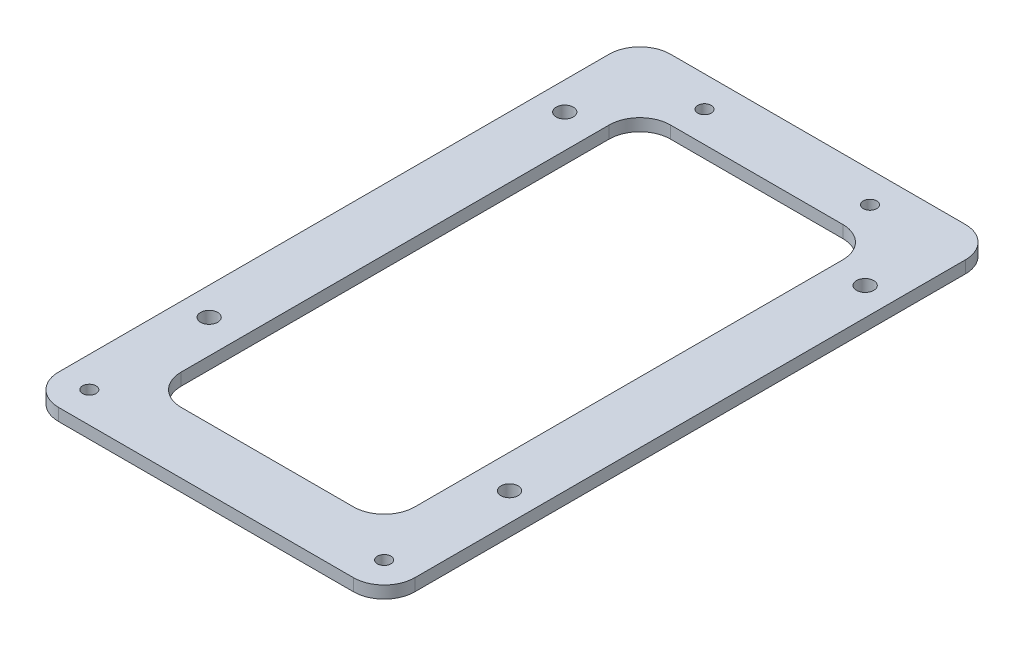
ISO-10303-21;
HEADER;
FILE_DESCRIPTION(('STEP AP214'),'2;1');
FILE_NAME('part.step','',(''),(''),'','','');
FILE_SCHEMA(('AUTOMOTIVE_DESIGN { 1 0 10303 214 1 1 1 1 }'));
ENDSEC;
DATA;
#1=APPLICATION_CONTEXT('core data for automotive mechanical design processes');
#2=APPLICATION_PROTOCOL_DEFINITION('international standard','automotive_design',2000,#1);
#3=PRODUCT_CONTEXT('',#1,'mechanical');
#4=PRODUCT('Part','Part','',(#3));
#5=PRODUCT_RELATED_PRODUCT_CATEGORY('part','',(#4));
#6=PRODUCT_DEFINITION_FORMATION('','',#4);
#7=PRODUCT_DEFINITION_CONTEXT('part definition',#1,'design');
#8=PRODUCT_DEFINITION('design','',#6,#7);
#9=PRODUCT_DEFINITION_SHAPE('','',#8);
#10=(LENGTH_UNIT() NAMED_UNIT(*) SI_UNIT(.MILLI.,.METRE.));
#11=(NAMED_UNIT(*) PLANE_ANGLE_UNIT() SI_UNIT($,.RADIAN.));
#12=(NAMED_UNIT(*) SI_UNIT($,.STERADIAN.) SOLID_ANGLE_UNIT());
#13=UNCERTAINTY_MEASURE_WITH_UNIT(LENGTH_MEASURE(1.E-05),#10,'distance_accuracy_value','');
#14=(GEOMETRIC_REPRESENTATION_CONTEXT(3) GLOBAL_UNCERTAINTY_ASSIGNED_CONTEXT((#13)) GLOBAL_UNIT_ASSIGNED_CONTEXT((#10,
#11,#12)) REPRESENTATION_CONTEXT('',''));
#15=CARTESIAN_POINT('',(0.,0.,0.));
#16=DIRECTION('',(0.,0.,1.));
#17=DIRECTION('',(1.,0.,0.));
#18=AXIS2_PLACEMENT_3D('',#15,#16,#17);
#19=CARTESIAN_POINT('',(0.,0.,0.));
#20=DIRECTION('',(0.,1.,0.));
#21=DIRECTION('',(0.,0.,1.));
#22=AXIS2_PLACEMENT_3D('',#19,#20,#21);
#23=PLANE('',#22);
#24=CARTESIAN_POINT('',(24.05,0.,50.1));
#25=DIRECTION('',(0.,1.,0.));
#26=DIRECTION('',(0.,0.,1.));
#27=AXIS2_PLACEMENT_3D('',#24,#25,#26);
#28=CIRCLE('',#27,1.09999999999999);
#29=CARTESIAN_POINT('',(24.05,0.,51.2));
#30=VERTEX_POINT('',#29);
#31=EDGE_CURVE('E319',#30,#30,#28,.T.);
#32=ORIENTED_EDGE('',*,*,#31,.T.);
#33=EDGE_LOOP('',(#32));
#34=FACE_BOUND('',#33,.T.);
#35=DIRECTION('',(0.,0.,1.));
#36=VECTOR('',#35,1.);
#37=CARTESIAN_POINT('',(-29.05,0.,-44.7));
#38=LINE('',#37,#36);
#39=CARTESIAN_POINT('',(-29.05,0.,-39.7));
#40=VERTEX_POINT('',#39);
#41=CARTESIAN_POINT('',(-29.05,0.,50.1));
#42=VERTEX_POINT('',#41);
#43=EDGE_CURVE('E344',#40,#42,#38,.T.);
#44=ORIENTED_EDGE('',*,*,#43,.F.);
#45=CARTESIAN_POINT('',(-24.05,0.,-39.7));
#46=DIRECTION('',(0.,1.,0.));
#47=DIRECTION('',(0.,0.,1.));
#48=AXIS2_PLACEMENT_3D('',#45,#46,#47);
#49=CIRCLE('',#48,5.);
#50=CARTESIAN_POINT('',(-24.05,0.,-44.7));
#51=VERTEX_POINT('',#50);
#52=EDGE_CURVE('E228',#40,#51,#49,.F.);
#53=ORIENTED_EDGE('',*,*,#52,.T.);
#54=DIRECTION('',(-1.,0.,0.));
#55=VECTOR('',#54,1.);
#56=CARTESIAN_POINT('',(29.05,0.,-44.7));
#57=LINE('',#56,#55);
#58=CARTESIAN_POINT('',(24.05,0.,-44.7));
#59=VERTEX_POINT('',#58);
#60=EDGE_CURVE('E327',#59,#51,#57,.T.);
#61=ORIENTED_EDGE('',*,*,#60,.F.);
#62=CARTESIAN_POINT('',(24.05,0.,-39.7));
#63=DIRECTION('',(0.,1.,0.));
#64=DIRECTION('',(0.,0.,1.));
#65=AXIS2_PLACEMENT_3D('',#62,#63,#64);
#66=CIRCLE('',#65,5.);
#67=CARTESIAN_POINT('',(29.05,0.,-39.7));
#68=VERTEX_POINT('',#67);
#69=EDGE_CURVE('E225',#59,#68,#66,.F.);
#70=ORIENTED_EDGE('',*,*,#69,.T.);
#71=DIRECTION('',(0.,0.,-1.));
#72=VECTOR('',#71,1.);
#73=CARTESIAN_POINT('',(29.05,0.,55.1));
#74=LINE('',#73,#72);
#75=CARTESIAN_POINT('',(29.05,0.,50.1));
#76=VERTEX_POINT('',#75);
#77=EDGE_CURVE('E193',#76,#68,#74,.T.);
#78=ORIENTED_EDGE('',*,*,#77,.F.);
#79=CARTESIAN_POINT('',(24.05,0.,50.1));
#80=DIRECTION('',(0.,1.,0.));
#81=DIRECTION('',(0.,0.,1.));
#82=AXIS2_PLACEMENT_3D('',#79,#80,#81);
#83=CIRCLE('',#82,5.);
#84=CARTESIAN_POINT('',(24.05,0.,55.1));
#85=VERTEX_POINT('',#84);
#86=EDGE_CURVE('E222',#76,#85,#83,.F.);
#87=ORIENTED_EDGE('',*,*,#86,.T.);
#88=DIRECTION('',(1.,0.,0.));
#89=VECTOR('',#88,1.);
#90=CARTESIAN_POINT('',(-29.05,0.,55.1));
#91=LINE('',#90,#89);
#92=CARTESIAN_POINT('',(-24.05,0.,55.1));
#93=VERTEX_POINT('',#92);
#94=EDGE_CURVE('E347',#93,#85,#91,.T.);
#95=ORIENTED_EDGE('',*,*,#94,.F.);
#96=CARTESIAN_POINT('',(-24.05,0.,50.1));
#97=DIRECTION('',(0.,1.,0.));
#98=DIRECTION('',(0.,0.,1.));
#99=AXIS2_PLACEMENT_3D('',#96,#97,#98);
#100=CIRCLE('',#99,5.);
#101=EDGE_CURVE('E219',#93,#42,#100,.F.);
#102=ORIENTED_EDGE('',*,*,#101,.T.);
#103=EDGE_LOOP('',(#44,#53,#61,#70,#78,#87,#95,#102));
#104=FACE_BOUND('',#103,.T.);
#105=DIRECTION('',(0.,0.,1.));
#106=VECTOR('',#105,1.);
#107=CARTESIAN_POINT('',(-19.05,0.,-34.7));
#108=LINE('',#107,#106);
#109=CARTESIAN_POINT('',(-19.05,0.,-29.7));
#110=VERTEX_POINT('',#109);
#111=CARTESIAN_POINT('',(-19.05,0.,40.1));
#112=VERTEX_POINT('',#111);
#113=EDGE_CURVE('E160',#110,#112,#108,.T.);
#114=ORIENTED_EDGE('',*,*,#113,.T.);
#115=CARTESIAN_POINT('',(-14.05,0.,40.1));
#116=DIRECTION('',(0.,1.,0.));
#117=DIRECTION('',(0.,0.,1.));
#118=AXIS2_PLACEMENT_3D('',#115,#116,#117);
#119=CIRCLE('',#118,5.);
#120=CARTESIAN_POINT('',(-14.05,0.,45.1));
#121=VERTEX_POINT('',#120);
#122=EDGE_CURVE('E155',#112,#121,#119,.T.);
#123=ORIENTED_EDGE('',*,*,#122,.T.);
#124=DIRECTION('',(1.,0.,0.));
#125=VECTOR('',#124,1.);
#126=CARTESIAN_POINT('',(-19.05,0.,45.1));
#127=LINE('',#126,#125);
#128=CARTESIAN_POINT('',(14.05,0.,45.1));
#129=VERTEX_POINT('',#128);
#130=EDGE_CURVE('E158',#121,#129,#127,.T.);
#131=ORIENTED_EDGE('',*,*,#130,.T.);
#132=CARTESIAN_POINT('',(14.05,0.,40.1));
#133=DIRECTION('',(0.,1.,0.));
#134=DIRECTION('',(0.,0.,1.));
#135=AXIS2_PLACEMENT_3D('',#132,#133,#134);
#136=CIRCLE('',#135,5.);
#137=CARTESIAN_POINT('',(19.05,0.,40.1));
#138=VERTEX_POINT('',#137);
#139=EDGE_CURVE('E265',#129,#138,#136,.T.);
#140=ORIENTED_EDGE('',*,*,#139,.T.);
#141=DIRECTION('',(0.,0.,-1.));
#142=VECTOR('',#141,1.);
#143=CARTESIAN_POINT('',(19.05,0.,45.1));
#144=LINE('',#143,#142);
#145=CARTESIAN_POINT('',(19.05,0.,-29.7));
#146=VERTEX_POINT('',#145);
#147=EDGE_CURVE('E178',#138,#146,#144,.T.);
#148=ORIENTED_EDGE('',*,*,#147,.T.);
#149=CARTESIAN_POINT('',(14.05,0.,-29.7));
#150=DIRECTION('',(0.,1.,0.));
#151=DIRECTION('',(0.,0.,1.));
#152=AXIS2_PLACEMENT_3D('',#149,#150,#151);
#153=CIRCLE('',#152,5.);
#154=CARTESIAN_POINT('',(14.05,0.,-34.7));
#155=VERTEX_POINT('',#154);
#156=EDGE_CURVE('E272',#146,#155,#153,.T.);
#157=ORIENTED_EDGE('',*,*,#156,.T.);
#158=DIRECTION('',(-1.,0.,0.));
#159=VECTOR('',#158,1.);
#160=CARTESIAN_POINT('',(19.05,0.,-34.7));
#161=LINE('',#160,#159);
#162=CARTESIAN_POINT('',(-14.05,0.,-34.7));
#163=VERTEX_POINT('',#162);
#164=EDGE_CURVE('E281',#155,#163,#161,.T.);
#165=ORIENTED_EDGE('',*,*,#164,.T.);
#166=CARTESIAN_POINT('',(-14.05,0.,-29.7));
#167=DIRECTION('',(0.,1.,0.));
#168=DIRECTION('',(0.,0.,1.));
#169=AXIS2_PLACEMENT_3D('',#166,#167,#168);
#170=CIRCLE('',#169,5.);
#171=EDGE_CURVE('E49',#163,#110,#170,.T.);
#172=ORIENTED_EDGE('',*,*,#171,.T.);
#173=EDGE_LOOP('',(#114,#123,#131,#140,#148,#157,#165,#172));
#174=FACE_BOUND('',#173,.T.);
#175=CARTESIAN_POINT('',(13.5,0.,-39.7));
#176=DIRECTION('',(0.,1.,0.));
#177=DIRECTION('',(0.,0.,1.));
#178=AXIS2_PLACEMENT_3D('',#175,#176,#177);
#179=CIRCLE('',#178,1.1);
#180=CARTESIAN_POINT('',(13.5,0.,-38.6));
#181=VERTEX_POINT('',#180);
#182=EDGE_CURVE('E311',#181,#181,#179,.T.);
#183=ORIENTED_EDGE('',*,*,#182,.T.);
#184=EDGE_LOOP('',(#183));
#185=FACE_BOUND('',#184,.T.);
#186=CARTESIAN_POINT('',(-13.5,0.,-39.7));
#187=DIRECTION('',(0.,1.,0.));
#188=DIRECTION('',(0.,0.,1.));
#189=AXIS2_PLACEMENT_3D('',#186,#187,#188);
#190=CIRCLE('',#189,1.1);
#191=CARTESIAN_POINT('',(-13.5,0.,-38.6));
#192=VERTEX_POINT('',#191);
#193=EDGE_CURVE('E677',#192,#192,#190,.T.);
#194=ORIENTED_EDGE('',*,*,#193,.T.);
#195=EDGE_LOOP('',(#194));
#196=FACE_BOUND('',#195,.T.);
#197=CARTESIAN_POINT('',(-24.05,0.,50.1));
#198=DIRECTION('',(0.,1.,0.));
#199=DIRECTION('',(0.,0.,1.));
#200=AXIS2_PLACEMENT_3D('',#197,#198,#199);
#201=CIRCLE('',#200,1.09999999999999);
#202=CARTESIAN_POINT('',(-24.05,0.,51.2));
#203=VERTEX_POINT('',#202);
#204=EDGE_CURVE('E669',#203,#203,#201,.T.);
#205=ORIENTED_EDGE('',*,*,#204,.T.);
#206=EDGE_LOOP('',(#205));
#207=FACE_BOUND('',#206,.T.);
#208=CARTESIAN_POINT('',(-24.5,0.,-27.9));
#209=DIRECTION('',(0.,1.,0.));
#210=DIRECTION('',(0.,0.,1.));
#211=AXIS2_PLACEMENT_3D('',#208,#209,#210);
#212=CIRCLE('',#211,1.4);
#213=CARTESIAN_POINT('',(-24.5,0.,-26.5));
#214=VERTEX_POINT('',#213);
#215=EDGE_CURVE('E661',#214,#214,#212,.T.);
#216=ORIENTED_EDGE('',*,*,#215,.T.);
#217=EDGE_LOOP('',(#216));
#218=FACE_BOUND('',#217,.T.);
#219=CARTESIAN_POINT('',(24.5,0.,-27.9));
#220=DIRECTION('',(0.,1.,0.));
#221=DIRECTION('',(0.,0.,1.));
#222=AXIS2_PLACEMENT_3D('',#219,#220,#221);
#223=CIRCLE('',#222,1.4);
#224=CARTESIAN_POINT('',(24.5,0.,-26.5));
#225=VERTEX_POINT('',#224);
#226=EDGE_CURVE('E653',#225,#225,#223,.T.);
#227=ORIENTED_EDGE('',*,*,#226,.T.);
#228=EDGE_LOOP('',(#227));
#229=FACE_BOUND('',#228,.T.);
#230=CARTESIAN_POINT('',(-24.5,0.,30.1));
#231=DIRECTION('',(0.,1.,0.));
#232=DIRECTION('',(0.,0.,1.));
#233=AXIS2_PLACEMENT_3D('',#230,#231,#232);
#234=CIRCLE('',#233,1.4);
#235=CARTESIAN_POINT('',(-24.5,0.,31.5));
#236=VERTEX_POINT('',#235);
#237=EDGE_CURVE('E646',#236,#236,#234,.T.);
#238=ORIENTED_EDGE('',*,*,#237,.T.);
#239=EDGE_LOOP('',(#238));
#240=FACE_BOUND('',#239,.T.);
#241=CARTESIAN_POINT('',(24.5,0.,30.1));
#242=DIRECTION('',(0.,1.,0.));
#243=DIRECTION('',(0.,0.,1.));
#244=AXIS2_PLACEMENT_3D('',#241,#242,#243);
#245=CIRCLE('',#244,1.4);
#246=CARTESIAN_POINT('',(24.5,0.,31.5));
#247=VERTEX_POINT('',#246);
#248=EDGE_CURVE('E641',#247,#247,#245,.T.);
#249=ORIENTED_EDGE('',*,*,#248,.T.);
#250=EDGE_LOOP('',(#249));
#251=FACE_BOUND('',#250,.T.);
#252=ADVANCED_FACE('F40',(#34,#104,#174,#185,#196,#207,#218,#229,#240,#251),#23,.F.);
#253=CARTESIAN_POINT('',(0.,2.,0.));
#254=DIRECTION('',(0.,1.,0.));
#255=DIRECTION('',(0.,0.,1.));
#256=AXIS2_PLACEMENT_3D('',#253,#254,#255);
#257=PLANE('',#256);
#258=CARTESIAN_POINT('',(-14.05,2.,40.1));
#259=DIRECTION('',(0.,1.,0.));
#260=DIRECTION('',(0.,0.,1.));
#261=AXIS2_PLACEMENT_3D('',#258,#259,#260);
#262=CIRCLE('',#261,5.);
#263=CARTESIAN_POINT('',(-14.05,2.,45.1));
#264=VERTEX_POINT('',#263);
#265=CARTESIAN_POINT('',(-19.05,2.,40.1));
#266=VERTEX_POINT('',#265);
#267=EDGE_CURVE('E166',#264,#266,#262,.F.);
#268=ORIENTED_EDGE('',*,*,#267,.T.);
#269=DIRECTION('',(0.,0.,1.));
#270=VECTOR('',#269,1.);
#271=CARTESIAN_POINT('',(-19.05,2.,-34.7));
#272=LINE('',#271,#270);
#273=CARTESIAN_POINT('',(-19.05,2.,-29.7));
#274=VERTEX_POINT('',#273);
#275=EDGE_CURVE('E299',#274,#266,#272,.T.);
#276=ORIENTED_EDGE('',*,*,#275,.F.);
#277=CARTESIAN_POINT('',(-14.05,2.,-29.7));
#278=DIRECTION('',(0.,1.,0.));
#279=DIRECTION('',(0.,0.,1.));
#280=AXIS2_PLACEMENT_3D('',#277,#278,#279);
#281=CIRCLE('',#280,5.);
#282=CARTESIAN_POINT('',(-14.05,2.,-34.7));
#283=VERTEX_POINT('',#282);
#284=EDGE_CURVE('E11',#274,#283,#281,.F.);
#285=ORIENTED_EDGE('',*,*,#284,.T.);
#286=DIRECTION('',(-1.,0.,0.));
#287=VECTOR('',#286,1.);
#288=CARTESIAN_POINT('',(19.05,2.,-34.7));
#289=LINE('',#288,#287);
#290=CARTESIAN_POINT('',(14.05,2.,-34.7));
#291=VERTEX_POINT('',#290);
#292=EDGE_CURVE('E297',#291,#283,#289,.T.);
#293=ORIENTED_EDGE('',*,*,#292,.F.);
#294=CARTESIAN_POINT('',(14.05,2.,-29.7));
#295=DIRECTION('',(0.,1.,0.));
#296=DIRECTION('',(0.,0.,1.));
#297=AXIS2_PLACEMENT_3D('',#294,#295,#296);
#298=CIRCLE('',#297,5.);
#299=CARTESIAN_POINT('',(19.05,2.,-29.7));
#300=VERTEX_POINT('',#299);
#301=EDGE_CURVE('E275',#291,#300,#298,.F.);
#302=ORIENTED_EDGE('',*,*,#301,.T.);
#303=DIRECTION('',(0.,0.,-1.));
#304=VECTOR('',#303,1.);
#305=CARTESIAN_POINT('',(19.05,2.,45.1));
#306=LINE('',#305,#304);
#307=CARTESIAN_POINT('',(19.05,2.,40.1));
#308=VERTEX_POINT('',#307);
#309=EDGE_CURVE('E316',#308,#300,#306,.T.);
#310=ORIENTED_EDGE('',*,*,#309,.F.);
#311=CARTESIAN_POINT('',(14.05,2.,40.1));
#312=DIRECTION('',(0.,1.,0.));
#313=DIRECTION('',(0.,0.,1.));
#314=AXIS2_PLACEMENT_3D('',#311,#312,#313);
#315=CIRCLE('',#314,5.);
#316=CARTESIAN_POINT('',(14.05,2.,45.1));
#317=VERTEX_POINT('',#316);
#318=EDGE_CURVE('E167',#308,#317,#315,.F.);
#319=ORIENTED_EDGE('',*,*,#318,.T.);
#320=DIRECTION('',(1.,0.,0.));
#321=VECTOR('',#320,1.);
#322=CARTESIAN_POINT('',(-19.05,2.,45.1));
#323=LINE('',#322,#321);
#324=EDGE_CURVE('E307',#264,#317,#323,.T.);
#325=ORIENTED_EDGE('',*,*,#324,.F.);
#326=EDGE_LOOP('',(#268,#276,#285,#293,#302,#310,#319,#325));
#327=FACE_BOUND('',#326,.T.);
#328=CARTESIAN_POINT('',(-24.5,2.,30.1));
#329=DIRECTION('',(0.,1.,0.));
#330=DIRECTION('',(0.,0.,1.));
#331=AXIS2_PLACEMENT_3D('',#328,#329,#330);
#332=CIRCLE('',#331,1.4);
#333=CARTESIAN_POINT('',(-24.5,2.,31.5));
#334=VERTEX_POINT('',#333);
#335=EDGE_CURVE('E649',#334,#334,#332,.T.);
#336=ORIENTED_EDGE('',*,*,#335,.F.);
#337=EDGE_LOOP('',(#336));
#338=FACE_BOUND('',#337,.T.);
#339=CARTESIAN_POINT('',(24.5,2.,-27.9));
#340=DIRECTION('',(0.,1.,0.));
#341=DIRECTION('',(0.,0.,1.));
#342=AXIS2_PLACEMENT_3D('',#339,#340,#341);
#343=CIRCLE('',#342,1.4);
#344=CARTESIAN_POINT('',(24.5,2.,-26.5));
#345=VERTEX_POINT('',#344);
#346=EDGE_CURVE('E657',#345,#345,#343,.T.);
#347=ORIENTED_EDGE('',*,*,#346,.F.);
#348=EDGE_LOOP('',(#347));
#349=FACE_BOUND('',#348,.T.);
#350=CARTESIAN_POINT('',(-24.05,2.,50.1));
#351=DIRECTION('',(0.,1.,0.));
#352=DIRECTION('',(0.,0.,1.));
#353=AXIS2_PLACEMENT_3D('',#350,#351,#352);
#354=CIRCLE('',#353,1.09999999999999);
#355=CARTESIAN_POINT('',(-24.05,2.,51.2));
#356=VERTEX_POINT('',#355);
#357=EDGE_CURVE('E673',#356,#356,#354,.T.);
#358=ORIENTED_EDGE('',*,*,#357,.F.);
#359=EDGE_LOOP('',(#358));
#360=FACE_BOUND('',#359,.T.);
#361=CARTESIAN_POINT('',(13.5,2.,-39.7));
#362=DIRECTION('',(0.,1.,0.));
#363=DIRECTION('',(0.,0.,1.));
#364=AXIS2_PLACEMENT_3D('',#361,#362,#363);
#365=CIRCLE('',#364,1.1);
#366=CARTESIAN_POINT('',(13.5,2.,-38.6));
#367=VERTEX_POINT('',#366);
#368=EDGE_CURVE('E321',#367,#367,#365,.T.);
#369=ORIENTED_EDGE('',*,*,#368,.F.);
#370=EDGE_LOOP('',(#369));
#371=FACE_BOUND('',#370,.T.);
#372=CARTESIAN_POINT('',(24.05,2.,50.1));
#373=DIRECTION('',(0.,1.,0.));
#374=DIRECTION('',(0.,0.,1.));
#375=AXIS2_PLACEMENT_3D('',#372,#373,#374);
#376=CIRCLE('',#375,1.09999999999999);
#377=CARTESIAN_POINT('',(24.05,2.,51.2));
#378=VERTEX_POINT('',#377);
#379=EDGE_CURVE('E323',#378,#378,#376,.T.);
#380=ORIENTED_EDGE('',*,*,#379,.F.);
#381=EDGE_LOOP('',(#380));
#382=FACE_BOUND('',#381,.T.);
#383=DIRECTION('',(-1.,0.,0.));
#384=VECTOR('',#383,1.);
#385=CARTESIAN_POINT('',(29.05,2.,-44.7));
#386=LINE('',#385,#384);
#387=CARTESIAN_POINT('',(24.05,2.,-44.7));
#388=VERTEX_POINT('',#387);
#389=CARTESIAN_POINT('',(-24.05,2.,-44.7));
#390=VERTEX_POINT('',#389);
#391=EDGE_CURVE('E331',#388,#390,#386,.T.);
#392=ORIENTED_EDGE('',*,*,#391,.T.);
#393=CARTESIAN_POINT('',(-24.05,2.,-39.7));
#394=DIRECTION('',(0.,1.,0.));
#395=DIRECTION('',(0.,0.,1.));
#396=AXIS2_PLACEMENT_3D('',#393,#394,#395);
#397=CIRCLE('',#396,5.);
#398=CARTESIAN_POINT('',(-29.05,2.,-39.7));
#399=VERTEX_POINT('',#398);
#400=EDGE_CURVE('E246',#390,#399,#397,.T.);
#401=ORIENTED_EDGE('',*,*,#400,.T.);
#402=DIRECTION('',(0.,0.,1.));
#403=VECTOR('',#402,1.);
#404=CARTESIAN_POINT('',(-29.05,2.,-44.7));
#405=LINE('',#404,#403);
#406=CARTESIAN_POINT('',(-29.05,2.,50.1));
#407=VERTEX_POINT('',#406);
#408=EDGE_CURVE('E335',#399,#407,#405,.T.);
#409=ORIENTED_EDGE('',*,*,#408,.T.);
#410=CARTESIAN_POINT('',(-24.05,2.,50.1));
#411=DIRECTION('',(0.,1.,0.));
#412=DIRECTION('',(0.,0.,1.));
#413=AXIS2_PLACEMENT_3D('',#410,#411,#412);
#414=CIRCLE('',#413,5.);
#415=CARTESIAN_POINT('',(-24.05,2.,55.1));
#416=VERTEX_POINT('',#415);
#417=EDGE_CURVE('E238',#407,#416,#414,.T.);
#418=ORIENTED_EDGE('',*,*,#417,.T.);
#419=DIRECTION('',(1.,0.,0.));
#420=VECTOR('',#419,1.);
#421=CARTESIAN_POINT('',(-29.05,2.,55.1));
#422=LINE('',#421,#420);
#423=CARTESIAN_POINT('',(24.05,2.,55.1));
#424=VERTEX_POINT('',#423);
#425=EDGE_CURVE('E190',#416,#424,#422,.T.);
#426=ORIENTED_EDGE('',*,*,#425,.T.);
#427=CARTESIAN_POINT('',(24.05,2.,50.1));
#428=DIRECTION('',(0.,1.,0.));
#429=DIRECTION('',(0.,0.,1.));
#430=AXIS2_PLACEMENT_3D('',#427,#428,#429);
#431=CIRCLE('',#430,5.);
#432=CARTESIAN_POINT('',(29.05,2.,50.1));
#433=VERTEX_POINT('',#432);
#434=EDGE_CURVE('E63',#424,#433,#431,.T.);
#435=ORIENTED_EDGE('',*,*,#434,.T.);
#436=DIRECTION('',(0.,0.,-1.));
#437=VECTOR('',#436,1.);
#438=CARTESIAN_POINT('',(29.05,2.,55.1));
#439=LINE('',#438,#437);
#440=CARTESIAN_POINT('',(29.05,2.,-39.7));
#441=VERTEX_POINT('',#440);
#442=EDGE_CURVE('E184',#433,#441,#439,.T.);
#443=ORIENTED_EDGE('',*,*,#442,.T.);
#444=CARTESIAN_POINT('',(24.05,2.,-39.7));
#445=DIRECTION('',(0.,1.,0.));
#446=DIRECTION('',(0.,0.,1.));
#447=AXIS2_PLACEMENT_3D('',#444,#445,#446);
#448=CIRCLE('',#447,5.);
#449=EDGE_CURVE('E243',#441,#388,#448,.T.);
#450=ORIENTED_EDGE('',*,*,#449,.T.);
#451=EDGE_LOOP('',(#392,#401,#409,#418,#426,#435,#443,#450));
#452=FACE_BOUND('',#451,.T.);
#453=CARTESIAN_POINT('',(-13.5,2.,-39.7));
#454=DIRECTION('',(0.,1.,0.));
#455=DIRECTION('',(0.,0.,1.));
#456=AXIS2_PLACEMENT_3D('',#453,#454,#455);
#457=CIRCLE('',#456,1.1);
#458=CARTESIAN_POINT('',(-13.5,2.,-38.6));
#459=VERTEX_POINT('',#458);
#460=EDGE_CURVE('E681',#459,#459,#457,.T.);
#461=ORIENTED_EDGE('',*,*,#460,.F.);
#462=EDGE_LOOP('',(#461));
#463=FACE_BOUND('',#462,.T.);
#464=CARTESIAN_POINT('',(-24.5,2.,-27.9));
#465=DIRECTION('',(0.,1.,0.));
#466=DIRECTION('',(0.,0.,1.));
#467=AXIS2_PLACEMENT_3D('',#464,#465,#466);
#468=CIRCLE('',#467,1.4);
#469=CARTESIAN_POINT('',(-24.5,2.,-26.5));
#470=VERTEX_POINT('',#469);
#471=EDGE_CURVE('E665',#470,#470,#468,.T.);
#472=ORIENTED_EDGE('',*,*,#471,.F.);
#473=EDGE_LOOP('',(#472));
#474=FACE_BOUND('',#473,.T.);
#475=CARTESIAN_POINT('',(24.5,2.,30.1));
#476=DIRECTION('',(0.,1.,0.));
#477=DIRECTION('',(0.,0.,1.));
#478=AXIS2_PLACEMENT_3D('',#475,#476,#477);
#479=CIRCLE('',#478,1.4);
#480=CARTESIAN_POINT('',(24.5,2.,31.5));
#481=VERTEX_POINT('',#480);
#482=EDGE_CURVE('E638',#481,#481,#479,.T.);
#483=ORIENTED_EDGE('',*,*,#482,.F.);
#484=EDGE_LOOP('',(#483));
#485=FACE_BOUND('',#484,.T.);
#486=ADVANCED_FACE('F295',(#327,#338,#349,#360,#371,#382,#452,#463,#474,#485),#257,.T.);
#487=CARTESIAN_POINT('',(29.05,2.,-44.7));
#488=DIRECTION('',(0.,0.,1.));
#489=DIRECTION('',(1.,0.,0.));
#490=AXIS2_PLACEMENT_3D('',#487,#488,#489);
#491=PLANE('',#490);
#492=ORIENTED_EDGE('',*,*,#60,.T.);
#493=DIRECTION('',(0.,-1.,0.));
#494=VECTOR('',#493,1.);
#495=CARTESIAN_POINT('',(-24.05,2.,-44.7));
#496=LINE('',#495,#494);
#497=EDGE_CURVE('E235',#51,#390,#496,.F.);
#498=ORIENTED_EDGE('',*,*,#497,.T.);
#499=ORIENTED_EDGE('',*,*,#391,.F.);
#500=DIRECTION('',(0.,-1.,0.));
#501=VECTOR('',#500,1.);
#502=CARTESIAN_POINT('',(24.05,2.,-44.7));
#503=LINE('',#502,#501);
#504=EDGE_CURVE('E231',#388,#59,#503,.T.);
#505=ORIENTED_EDGE('',*,*,#504,.T.);
#506=EDGE_LOOP('',(#492,#498,#499,#505));
#507=FACE_BOUND('',#506,.T.);
#508=ADVANCED_FACE('F366',(#507),#491,.F.);
#509=CARTESIAN_POINT('',(-29.05,2.,-44.7));
#510=DIRECTION('',(1.,0.,0.));
#511=DIRECTION('',(0.,0.,-1.));
#512=AXIS2_PLACEMENT_3D('',#509,#510,#511);
#513=PLANE('',#512);
#514=ORIENTED_EDGE('',*,*,#408,.F.);
#515=DIRECTION('',(0.,-1.,0.));
#516=VECTOR('',#515,1.);
#517=CARTESIAN_POINT('',(-29.05,2.,-39.7));
#518=LINE('',#517,#516);
#519=EDGE_CURVE('E215',#399,#40,#518,.T.);
#520=ORIENTED_EDGE('',*,*,#519,.T.);
#521=ORIENTED_EDGE('',*,*,#43,.T.);
#522=DIRECTION('',(0.,-1.,0.));
#523=VECTOR('',#522,1.);
#524=CARTESIAN_POINT('',(-29.05,2.,50.1));
#525=LINE('',#524,#523);
#526=EDGE_CURVE('E212',#42,#407,#525,.F.);
#527=ORIENTED_EDGE('',*,*,#526,.T.);
#528=EDGE_LOOP('',(#514,#520,#521,#527));
#529=FACE_BOUND('',#528,.T.);
#530=ADVANCED_FACE('F375',(#529),#513,.F.);
#531=CARTESIAN_POINT('',(-29.05,2.,55.1));
#532=DIRECTION('',(0.,0.,-1.));
#533=DIRECTION('',(-1.,0.,0.));
#534=AXIS2_PLACEMENT_3D('',#531,#532,#533);
#535=PLANE('',#534);
#536=ORIENTED_EDGE('',*,*,#94,.T.);
#537=DIRECTION('',(0.,-1.,0.));
#538=VECTOR('',#537,1.);
#539=CARTESIAN_POINT('',(24.05,2.,55.1));
#540=LINE('',#539,#538);
#541=EDGE_CURVE('E262',#85,#424,#540,.F.);
#542=ORIENTED_EDGE('',*,*,#541,.T.);
#543=ORIENTED_EDGE('',*,*,#425,.F.);
#544=DIRECTION('',(0.,-1.,0.));
#545=VECTOR('',#544,1.);
#546=CARTESIAN_POINT('',(-24.05,2.,55.1));
#547=LINE('',#546,#545);
#548=EDGE_CURVE('E258',#416,#93,#547,.T.);
#549=ORIENTED_EDGE('',*,*,#548,.T.);
#550=EDGE_LOOP('',(#536,#542,#543,#549));
#551=FACE_BOUND('',#550,.T.);
#552=ADVANCED_FACE('F381',(#551),#535,.F.);
#553=CARTESIAN_POINT('',(29.05,2.,55.1));
#554=DIRECTION('',(-1.,0.,0.));
#555=DIRECTION('',(0.,0.,1.));
#556=AXIS2_PLACEMENT_3D('',#553,#554,#555);
#557=PLANE('',#556);
#558=ORIENTED_EDGE('',*,*,#77,.T.);
#559=DIRECTION('',(0.,-1.,0.));
#560=VECTOR('',#559,1.);
#561=CARTESIAN_POINT('',(29.05,2.,-39.7));
#562=LINE('',#561,#560);
#563=EDGE_CURVE('E56',#68,#441,#562,.F.);
#564=ORIENTED_EDGE('',*,*,#563,.T.);
#565=ORIENTED_EDGE('',*,*,#442,.F.);
#566=DIRECTION('',(0.,-1.,0.));
#567=VECTOR('',#566,1.);
#568=CARTESIAN_POINT('',(29.05,2.,50.1));
#569=LINE('',#568,#567);
#570=EDGE_CURVE('E252',#433,#76,#569,.T.);
#571=ORIENTED_EDGE('',*,*,#570,.T.);
#572=EDGE_LOOP('',(#558,#564,#565,#571));
#573=FACE_BOUND('',#572,.T.);
#574=ADVANCED_FACE('F355',(#573),#557,.F.);
#575=CARTESIAN_POINT('',(24.05,2.,50.1));
#576=DIRECTION('',(0.,-1.,0.));
#577=DIRECTION('',(0.,0.,-1.));
#578=AXIS2_PLACEMENT_3D('',#575,#576,#577);
#579=CYLINDRICAL_SURFACE('',#578,1.09999999999999);
#580=ORIENTED_EDGE('',*,*,#379,.T.);
#581=EDGE_LOOP('',(#580));
#582=FACE_BOUND('',#581,.T.);
#583=ORIENTED_EDGE('',*,*,#31,.F.);
#584=EDGE_LOOP('',(#583));
#585=FACE_BOUND('',#584,.T.);
#586=ADVANCED_FACE('F396',(#582,#585),#579,.F.);
#587=CARTESIAN_POINT('',(19.05,2.,-22.0905591591021));
#588=DIRECTION('',(-1.,0.,0.));
#589=DIRECTION('',(0.,0.,1.));
#590=AXIS2_PLACEMENT_3D('',#587,#588,#589);
#591=PLANE('',#590);
#592=DIRECTION('',(0.,-1.,0.));
#593=VECTOR('',#592,1.);
#594=CARTESIAN_POINT('',(19.05,0.,-29.7));
#595=LINE('',#594,#593);
#596=EDGE_CURVE('E201',#300,#146,#595,.T.);
#597=ORIENTED_EDGE('',*,*,#596,.T.);
#598=ORIENTED_EDGE('',*,*,#147,.F.);
#599=DIRECTION('',(0.,-1.,0.));
#600=VECTOR('',#599,1.);
#601=CARTESIAN_POINT('',(19.05,2.,40.1));
#602=LINE('',#601,#600);
#603=EDGE_CURVE('E188',#138,#308,#602,.F.);
#604=ORIENTED_EDGE('',*,*,#603,.T.);
#605=ORIENTED_EDGE('',*,*,#309,.T.);
#606=EDGE_LOOP('',(#597,#598,#604,#605));
#607=FACE_BOUND('',#606,.T.);
#608=ADVANCED_FACE('F427',(#607),#591,.T.);
#609=CARTESIAN_POINT('',(19.05,2.,-34.7));
#610=DIRECTION('',(0.,0.,1.));
#611=DIRECTION('',(1.,0.,0.));
#612=AXIS2_PLACEMENT_3D('',#609,#610,#611);
#613=PLANE('',#612);
#614=ORIENTED_EDGE('',*,*,#164,.F.);
#615=DIRECTION('',(0.,-1.,0.));
#616=VECTOR('',#615,1.);
#617=CARTESIAN_POINT('',(14.05,2.,-34.7));
#618=LINE('',#617,#616);
#619=EDGE_CURVE('E209',#155,#291,#618,.F.);
#620=ORIENTED_EDGE('',*,*,#619,.T.);
#621=ORIENTED_EDGE('',*,*,#292,.T.);
#622=DIRECTION('',(0.,-1.,0.));
#623=VECTOR('',#622,1.);
#624=CARTESIAN_POINT('',(-14.05,0.,-34.7));
#625=LINE('',#624,#623);
#626=EDGE_CURVE('E205',#283,#163,#625,.T.);
#627=ORIENTED_EDGE('',*,*,#626,.T.);
#628=EDGE_LOOP('',(#614,#620,#621,#627));
#629=FACE_BOUND('',#628,.T.);
#630=ADVANCED_FACE('F301',(#629),#613,.T.);
#631=CARTESIAN_POINT('',(-19.05,2.,-34.7));
#632=DIRECTION('',(1.,0.,0.));
#633=DIRECTION('',(0.,0.,-1.));
#634=AXIS2_PLACEMENT_3D('',#631,#632,#633);
#635=PLANE('',#634);
#636=ORIENTED_EDGE('',*,*,#275,.T.);
#637=DIRECTION('',(0.,-1.,0.));
#638=VECTOR('',#637,1.);
#639=CARTESIAN_POINT('',(-19.05,0.,40.1));
#640=LINE('',#639,#638);
#641=EDGE_CURVE('E198',#266,#112,#640,.T.);
#642=ORIENTED_EDGE('',*,*,#641,.T.);
#643=ORIENTED_EDGE('',*,*,#113,.F.);
#644=DIRECTION('',(0.,-1.,0.));
#645=VECTOR('',#644,1.);
#646=CARTESIAN_POINT('',(-19.05,2.,-29.7));
#647=LINE('',#646,#645);
#648=EDGE_CURVE('E249',#110,#274,#647,.F.);
#649=ORIENTED_EDGE('',*,*,#648,.T.);
#650=EDGE_LOOP('',(#636,#642,#643,#649));
#651=FACE_BOUND('',#650,.T.);
#652=ADVANCED_FACE('F286',(#651),#635,.T.);
#653=CARTESIAN_POINT('',(-19.05,2.,45.1));
#654=DIRECTION('',(0.,0.,-1.));
#655=DIRECTION('',(-1.,0.,0.));
#656=AXIS2_PLACEMENT_3D('',#653,#654,#655);
#657=PLANE('',#656);
#658=ORIENTED_EDGE('',*,*,#324,.T.);
#659=DIRECTION('',(0.,-1.,0.));
#660=VECTOR('',#659,1.);
#661=CARTESIAN_POINT('',(14.05,0.,45.1));
#662=LINE('',#661,#660);
#663=EDGE_CURVE('E176',#317,#129,#662,.T.);
#664=ORIENTED_EDGE('',*,*,#663,.T.);
#665=ORIENTED_EDGE('',*,*,#130,.F.);
#666=DIRECTION('',(0.,-1.,0.));
#667=VECTOR('',#666,1.);
#668=CARTESIAN_POINT('',(-14.05,2.,45.1));
#669=LINE('',#668,#667);
#670=EDGE_CURVE('E173',#121,#264,#669,.F.);
#671=ORIENTED_EDGE('',*,*,#670,.T.);
#672=EDGE_LOOP('',(#658,#664,#665,#671));
#673=FACE_BOUND('',#672,.T.);
#674=ADVANCED_FACE('F172',(#673),#657,.T.);
#675=CARTESIAN_POINT('',(13.5,2.,-39.7));
#676=DIRECTION('',(0.,-1.,0.));
#677=DIRECTION('',(0.,0.,-1.));
#678=AXIS2_PLACEMENT_3D('',#675,#676,#677);
#679=CYLINDRICAL_SURFACE('',#678,1.1);
#680=ORIENTED_EDGE('',*,*,#368,.T.);
#681=EDGE_LOOP('',(#680));
#682=FACE_BOUND('',#681,.T.);
#683=ORIENTED_EDGE('',*,*,#182,.F.);
#684=EDGE_LOOP('',(#683));
#685=FACE_BOUND('',#684,.T.);
#686=ADVANCED_FACE('F482',(#682,#685),#679,.F.);
#687=CARTESIAN_POINT('',(-13.5,2.,-39.7));
#688=DIRECTION('',(0.,-1.,0.));
#689=DIRECTION('',(0.,0.,-1.));
#690=AXIS2_PLACEMENT_3D('',#687,#688,#689);
#691=CYLINDRICAL_SURFACE('',#690,1.1);
#692=ORIENTED_EDGE('',*,*,#460,.T.);
#693=EDGE_LOOP('',(#692));
#694=FACE_BOUND('',#693,.T.);
#695=ORIENTED_EDGE('',*,*,#193,.F.);
#696=EDGE_LOOP('',(#695));
#697=FACE_BOUND('',#696,.T.);
#698=ADVANCED_FACE('F491',(#694,#697),#691,.F.);
#699=CARTESIAN_POINT('',(-24.05,2.,50.1));
#700=DIRECTION('',(0.,-1.,0.));
#701=DIRECTION('',(0.,0.,-1.));
#702=AXIS2_PLACEMENT_3D('',#699,#700,#701);
#703=CYLINDRICAL_SURFACE('',#702,1.09999999999999);
#704=ORIENTED_EDGE('',*,*,#357,.T.);
#705=EDGE_LOOP('',(#704));
#706=FACE_BOUND('',#705,.T.);
#707=ORIENTED_EDGE('',*,*,#204,.F.);
#708=EDGE_LOOP('',(#707));
#709=FACE_BOUND('',#708,.T.);
#710=ADVANCED_FACE('F500',(#706,#709),#703,.F.);
#711=CARTESIAN_POINT('',(-24.5,2.,-27.9));
#712=DIRECTION('',(0.,-1.,0.));
#713=DIRECTION('',(0.,0.,-1.));
#714=AXIS2_PLACEMENT_3D('',#711,#712,#713);
#715=CYLINDRICAL_SURFACE('',#714,1.4);
#716=ORIENTED_EDGE('',*,*,#471,.T.);
#717=EDGE_LOOP('',(#716));
#718=FACE_BOUND('',#717,.T.);
#719=ORIENTED_EDGE('',*,*,#215,.F.);
#720=EDGE_LOOP('',(#719));
#721=FACE_BOUND('',#720,.T.);
#722=ADVANCED_FACE('F509',(#718,#721),#715,.F.);
#723=CARTESIAN_POINT('',(24.5,2.,-27.9));
#724=DIRECTION('',(0.,-1.,0.));
#725=DIRECTION('',(0.,0.,-1.));
#726=AXIS2_PLACEMENT_3D('',#723,#724,#725);
#727=CYLINDRICAL_SURFACE('',#726,1.4);
#728=ORIENTED_EDGE('',*,*,#346,.T.);
#729=EDGE_LOOP('',(#728));
#730=FACE_BOUND('',#729,.T.);
#731=ORIENTED_EDGE('',*,*,#226,.F.);
#732=EDGE_LOOP('',(#731));
#733=FACE_BOUND('',#732,.T.);
#734=ADVANCED_FACE('F518',(#730,#733),#727,.F.);
#735=CARTESIAN_POINT('',(-24.5,2.,30.1));
#736=DIRECTION('',(0.,-1.,0.));
#737=DIRECTION('',(0.,0.,-1.));
#738=AXIS2_PLACEMENT_3D('',#735,#736,#737);
#739=CYLINDRICAL_SURFACE('',#738,1.4);
#740=ORIENTED_EDGE('',*,*,#335,.T.);
#741=EDGE_LOOP('',(#740));
#742=FACE_BOUND('',#741,.T.);
#743=ORIENTED_EDGE('',*,*,#237,.F.);
#744=EDGE_LOOP('',(#743));
#745=FACE_BOUND('',#744,.T.);
#746=ADVANCED_FACE('F527',(#742,#745),#739,.F.);
#747=CARTESIAN_POINT('',(24.5,2.,30.1));
#748=DIRECTION('',(0.,-1.,0.));
#749=DIRECTION('',(0.,0.,-1.));
#750=AXIS2_PLACEMENT_3D('',#747,#748,#749);
#751=CYLINDRICAL_SURFACE('',#750,1.4);
#752=ORIENTED_EDGE('',*,*,#482,.T.);
#753=EDGE_LOOP('',(#752));
#754=FACE_BOUND('',#753,.T.);
#755=ORIENTED_EDGE('',*,*,#248,.F.);
#756=EDGE_LOOP('',(#755));
#757=FACE_BOUND('',#756,.T.);
#758=ADVANCED_FACE('F406',(#754,#757),#751,.F.);
#759=CARTESIAN_POINT('',(14.05,2.,40.1));
#760=DIRECTION('',(0.,1.,0.));
#761=DIRECTION('',(0.,0.,1.));
#762=AXIS2_PLACEMENT_3D('',#759,#760,#761);
#763=CYLINDRICAL_SURFACE('',#762,5.);
#764=ORIENTED_EDGE('',*,*,#318,.F.);
#765=ORIENTED_EDGE('',*,*,#603,.F.);
#766=ORIENTED_EDGE('',*,*,#139,.F.);
#767=ORIENTED_EDGE('',*,*,#663,.F.);
#768=EDGE_LOOP('',(#764,#765,#766,#767));
#769=FACE_BOUND('',#768,.T.);
#770=ADVANCED_FACE('F403',(#769),#763,.F.);
#771=CARTESIAN_POINT('',(-14.05,2.,40.1));
#772=DIRECTION('',(0.,1.,0.));
#773=DIRECTION('',(0.,0.,1.));
#774=AXIS2_PLACEMENT_3D('',#771,#772,#773);
#775=CYLINDRICAL_SURFACE('',#774,5.);
#776=ORIENTED_EDGE('',*,*,#267,.F.);
#777=ORIENTED_EDGE('',*,*,#670,.F.);
#778=ORIENTED_EDGE('',*,*,#122,.F.);
#779=ORIENTED_EDGE('',*,*,#641,.F.);
#780=EDGE_LOOP('',(#776,#777,#778,#779));
#781=FACE_BOUND('',#780,.T.);
#782=ADVANCED_FACE('F181',(#781),#775,.F.);
#783=CARTESIAN_POINT('',(14.05,2.,-29.7));
#784=DIRECTION('',(0.,1.,0.));
#785=DIRECTION('',(0.,0.,1.));
#786=AXIS2_PLACEMENT_3D('',#783,#784,#785);
#787=CYLINDRICAL_SURFACE('',#786,5.);
#788=ORIENTED_EDGE('',*,*,#301,.F.);
#789=ORIENTED_EDGE('',*,*,#619,.F.);
#790=ORIENTED_EDGE('',*,*,#156,.F.);
#791=ORIENTED_EDGE('',*,*,#596,.F.);
#792=EDGE_LOOP('',(#788,#789,#790,#791));
#793=FACE_BOUND('',#792,.T.);
#794=ADVANCED_FACE('F410',(#793),#787,.F.);
#795=CARTESIAN_POINT('',(-24.05,2.,-39.7));
#796=DIRECTION('',(0.,-1.,0.));
#797=DIRECTION('',(0.,0.,-1.));
#798=AXIS2_PLACEMENT_3D('',#795,#796,#797);
#799=CYLINDRICAL_SURFACE('',#798,5.);
#800=ORIENTED_EDGE('',*,*,#400,.F.);
#801=ORIENTED_EDGE('',*,*,#497,.F.);
#802=ORIENTED_EDGE('',*,*,#52,.F.);
#803=ORIENTED_EDGE('',*,*,#519,.F.);
#804=EDGE_LOOP('',(#800,#801,#802,#803));
#805=FACE_BOUND('',#804,.T.);
#806=ADVANCED_FACE('F370',(#805),#799,.T.);
#807=CARTESIAN_POINT('',(-14.05,2.,-29.7));
#808=DIRECTION('',(0.,1.,0.));
#809=DIRECTION('',(0.,0.,1.));
#810=AXIS2_PLACEMENT_3D('',#807,#808,#809);
#811=CYLINDRICAL_SURFACE('',#810,5.);
#812=ORIENTED_EDGE('',*,*,#284,.F.);
#813=ORIENTED_EDGE('',*,*,#648,.F.);
#814=ORIENTED_EDGE('',*,*,#171,.F.);
#815=ORIENTED_EDGE('',*,*,#626,.F.);
#816=EDGE_LOOP('',(#812,#813,#814,#815));
#817=FACE_BOUND('',#816,.T.);
#818=ADVANCED_FACE('F291',(#817),#811,.F.);
#819=CARTESIAN_POINT('',(24.05,2.,-39.7));
#820=DIRECTION('',(0.,-1.,0.));
#821=DIRECTION('',(0.,0.,-1.));
#822=AXIS2_PLACEMENT_3D('',#819,#820,#821);
#823=CYLINDRICAL_SURFACE('',#822,5.);
#824=ORIENTED_EDGE('',*,*,#449,.F.);
#825=ORIENTED_EDGE('',*,*,#563,.F.);
#826=ORIENTED_EDGE('',*,*,#69,.F.);
#827=ORIENTED_EDGE('',*,*,#504,.F.);
#828=EDGE_LOOP('',(#824,#825,#826,#827));
#829=FACE_BOUND('',#828,.T.);
#830=ADVANCED_FACE('F360',(#829),#823,.T.);
#831=CARTESIAN_POINT('',(24.05,2.,50.1));
#832=DIRECTION('',(0.,-1.,0.));
#833=DIRECTION('',(0.,0.,-1.));
#834=AXIS2_PLACEMENT_3D('',#831,#832,#833);
#835=CYLINDRICAL_SURFACE('',#834,5.);
#836=ORIENTED_EDGE('',*,*,#434,.F.);
#837=ORIENTED_EDGE('',*,*,#541,.F.);
#838=ORIENTED_EDGE('',*,*,#86,.F.);
#839=ORIENTED_EDGE('',*,*,#570,.F.);
#840=EDGE_LOOP('',(#836,#837,#838,#839));
#841=FACE_BOUND('',#840,.T.);
#842=ADVANCED_FACE('F383',(#841),#835,.T.);
#843=CARTESIAN_POINT('',(-24.05,2.,50.1));
#844=DIRECTION('',(0.,-1.,0.));
#845=DIRECTION('',(0.,0.,-1.));
#846=AXIS2_PLACEMENT_3D('',#843,#844,#845);
#847=CYLINDRICAL_SURFACE('',#846,5.);
#848=ORIENTED_EDGE('',*,*,#417,.F.);
#849=ORIENTED_EDGE('',*,*,#526,.F.);
#850=ORIENTED_EDGE('',*,*,#101,.F.);
#851=ORIENTED_EDGE('',*,*,#548,.F.);
#852=EDGE_LOOP('',(#848,#849,#850,#851));
#853=FACE_BOUND('',#852,.T.);
#854=ADVANCED_FACE('F42',(#853),#847,.T.);
#855=CLOSED_SHELL('',(#252,#486,#508,#530,#552,#574,#586,#608,#630,#652,#674,#686,#698,#710,
#722,#734,#746,#758,#770,#782,#794,#806,#818,#830,#842,#854));
#856=MANIFOLD_SOLID_BREP('B2',#855);
#857=ADVANCED_BREP_SHAPE_REPRESENTATION('',(#18,#856),#14);
#858=SHAPE_DEFINITION_REPRESENTATION(#9,#857);
ENDSEC;
END-ISO-10303-21;
